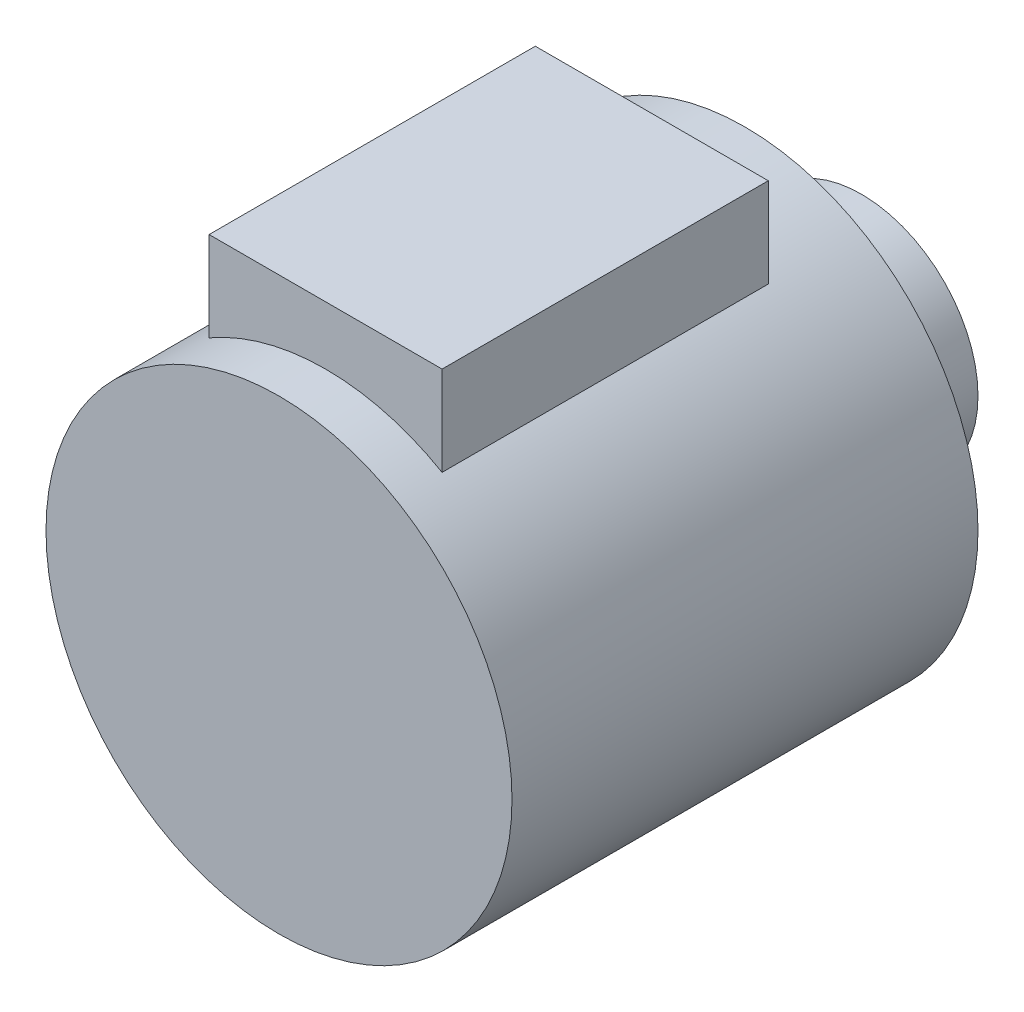
ISO-10303-21;
HEADER;
FILE_DESCRIPTION(('STEP AP214'),'2;1');
FILE_NAME('part.step','',(''),(''),'','','');
FILE_SCHEMA(('AUTOMOTIVE_DESIGN { 1 0 10303 214 1 1 1 1 }'));
ENDSEC;
DATA;
#1=APPLICATION_CONTEXT('core data for automotive mechanical design processes');
#2=APPLICATION_PROTOCOL_DEFINITION('international standard','automotive_design',2000,#1);
#3=PRODUCT_CONTEXT('',#1,'mechanical');
#4=PRODUCT('Part','Part','',(#3));
#5=PRODUCT_RELATED_PRODUCT_CATEGORY('part','',(#4));
#6=PRODUCT_DEFINITION_FORMATION('','',#4);
#7=PRODUCT_DEFINITION_CONTEXT('part definition',#1,'design');
#8=PRODUCT_DEFINITION('design','',#6,#7);
#9=PRODUCT_DEFINITION_SHAPE('','',#8);
#10=(LENGTH_UNIT() NAMED_UNIT(*) SI_UNIT(.MILLI.,.METRE.));
#11=(NAMED_UNIT(*) PLANE_ANGLE_UNIT() SI_UNIT($,.RADIAN.));
#12=(NAMED_UNIT(*) SI_UNIT($,.STERADIAN.) SOLID_ANGLE_UNIT());
#13=UNCERTAINTY_MEASURE_WITH_UNIT(LENGTH_MEASURE(1.E-05),#10,'distance_accuracy_value','');
#14=(GEOMETRIC_REPRESENTATION_CONTEXT(3) GLOBAL_UNCERTAINTY_ASSIGNED_CONTEXT((#13)) GLOBAL_UNIT_ASSIGNED_CONTEXT((#10,
#11,#12)) REPRESENTATION_CONTEXT('',''));
#15=CARTESIAN_POINT('',(0.,0.,0.));
#16=DIRECTION('',(0.,0.,1.));
#17=DIRECTION('',(1.,0.,0.));
#18=AXIS2_PLACEMENT_3D('',#15,#16,#17);
#19=CARTESIAN_POINT('',(0.,0.,50.));
#20=DIRECTION('',(0.,0.,-1.));
#21=DIRECTION('',(-1.,0.,0.));
#22=AXIS2_PLACEMENT_3D('',#19,#20,#21);
#23=CYLINDRICAL_SURFACE('',#22,20.);
#24=CARTESIAN_POINT('',(0.,0.,10.));
#25=DIRECTION('',(0.,0.,1.));
#26=DIRECTION('',(1.,0.,0.));
#27=AXIS2_PLACEMENT_3D('',#24,#25,#26);
#28=CIRCLE('',#27,20.);
#29=CARTESIAN_POINT('',(20.,0.,10.));
#30=VERTEX_POINT('',#29);
#31=EDGE_CURVE('E93',#30,#30,#28,.T.);
#32=ORIENTED_EDGE('',*,*,#31,.T.);
#33=EDGE_LOOP('',(#32));
#34=FACE_BOUND('',#33,.T.);
#35=CARTESIAN_POINT('',(0.,0.,50.));
#36=DIRECTION('',(0.,0.,1.));
#37=DIRECTION('',(1.,0.,0.));
#38=AXIS2_PLACEMENT_3D('',#35,#36,#37);
#39=CIRCLE('',#38,20.);
#40=CARTESIAN_POINT('',(20.,0.,50.));
#41=VERTEX_POINT('',#40);
#42=EDGE_CURVE('E96',#41,#41,#39,.T.);
#43=ORIENTED_EDGE('',*,*,#42,.F.);
#44=EDGE_LOOP('',(#43));
#45=FACE_BOUND('',#44,.T.);
#46=CARTESIAN_POINT('',(0.,0.,46.));
#47=DIRECTION('',(0.,0.,-1.));
#48=DIRECTION('',(-1.,0.,0.));
#49=AXIS2_PLACEMENT_3D('',#46,#47,#48);
#50=CIRCLE('',#49,20.);
#51=CARTESIAN_POINT('',(-9.99999999999999,17.3205080756888,46.));
#52=VERTEX_POINT('',#51);
#53=CARTESIAN_POINT('',(10.,17.3205080756888,46.));
#54=VERTEX_POINT('',#53);
#55=EDGE_CURVE('E11',#52,#54,#50,.T.);
#56=ORIENTED_EDGE('',*,*,#55,.F.);
#57=DIRECTION('',(0.,0.,-1.));
#58=VECTOR('',#57,1.);
#59=CARTESIAN_POINT('',(-9.99999999999999,17.3205080756888,50.));
#60=LINE('',#59,#58);
#61=CARTESIAN_POINT('',(-9.99999999999999,17.3205080756888,18.));
#62=VERTEX_POINT('',#61);
#63=EDGE_CURVE('E108',#62,#52,#60,.F.);
#64=ORIENTED_EDGE('',*,*,#63,.F.);
#65=CARTESIAN_POINT('',(0.,0.,18.));
#66=DIRECTION('',(0.,0.,1.));
#67=DIRECTION('',(1.,0.,0.));
#68=AXIS2_PLACEMENT_3D('',#65,#66,#67);
#69=CIRCLE('',#68,20.);
#70=CARTESIAN_POINT('',(9.99999999999999,17.3205080756888,18.));
#71=VERTEX_POINT('',#70);
#72=EDGE_CURVE('E53',#71,#62,#69,.T.);
#73=ORIENTED_EDGE('',*,*,#72,.F.);
#74=DIRECTION('',(0.,0.,-1.));
#75=VECTOR('',#74,1.);
#76=CARTESIAN_POINT('',(10.,17.3205080756888,50.));
#77=LINE('',#76,#75);
#78=EDGE_CURVE('E43',#54,#71,#77,.T.);
#79=ORIENTED_EDGE('',*,*,#78,.F.);
#80=EDGE_LOOP('',(#56,#64,#73,#79));
#81=FACE_BOUND('',#80,.T.);
#82=ADVANCED_FACE('F35',(#34,#45,#81),#23,.T.);
#83=CARTESIAN_POINT('',(0.,0.,10.));
#84=DIRECTION('',(0.,0.,-1.));
#85=DIRECTION('',(-1.,0.,0.));
#86=AXIS2_PLACEMENT_3D('',#83,#84,#85);
#87=CYLINDRICAL_SURFACE('',#86,10.);
#88=CARTESIAN_POINT('',(0.,0.,10.));
#89=DIRECTION('',(0.,0.,1.));
#90=DIRECTION('',(1.,0.,0.));
#91=AXIS2_PLACEMENT_3D('',#88,#89,#90);
#92=CIRCLE('',#91,10.);
#93=CARTESIAN_POINT('',(10.,0.,10.));
#94=VERTEX_POINT('',#93);
#95=EDGE_CURVE('E105',#94,#94,#92,.T.);
#96=ORIENTED_EDGE('',*,*,#95,.F.);
#97=EDGE_LOOP('',(#96));
#98=FACE_BOUND('',#97,.T.);
#99=CARTESIAN_POINT('',(0.,0.,0.));
#100=DIRECTION('',(0.,0.,1.));
#101=DIRECTION('',(1.,0.,0.));
#102=AXIS2_PLACEMENT_3D('',#99,#100,#101);
#103=CIRCLE('',#102,10.);
#104=CARTESIAN_POINT('',(10.,0.,0.));
#105=VERTEX_POINT('',#104);
#106=EDGE_CURVE('E103',#105,#105,#103,.T.);
#107=ORIENTED_EDGE('',*,*,#106,.T.);
#108=EDGE_LOOP('',(#107));
#109=FACE_BOUND('',#108,.T.);
#110=ADVANCED_FACE('F37',(#98,#109),#87,.T.);
#111=CARTESIAN_POINT('',(0.,0.,0.));
#112=DIRECTION('',(0.,0.,1.));
#113=DIRECTION('',(1.,0.,0.));
#114=AXIS2_PLACEMENT_3D('',#111,#112,#113);
#115=PLANE('',#114);
#116=ORIENTED_EDGE('',*,*,#106,.F.);
#117=EDGE_LOOP('',(#116));
#118=FACE_BOUND('',#117,.T.);
#119=ADVANCED_FACE('F129',(#118),#115,.F.);
#120=CARTESIAN_POINT('',(0.,0.,50.));
#121=DIRECTION('',(0.,0.,1.));
#122=DIRECTION('',(1.,0.,0.));
#123=AXIS2_PLACEMENT_3D('',#120,#121,#122);
#124=PLANE('',#123);
#125=ORIENTED_EDGE('',*,*,#42,.T.);
#126=EDGE_LOOP('',(#125));
#127=FACE_BOUND('',#126,.T.);
#128=ADVANCED_FACE('F136',(#127),#124,.T.);
#129=CARTESIAN_POINT('',(0.,0.,10.));
#130=DIRECTION('',(0.,0.,1.));
#131=DIRECTION('',(1.,0.,0.));
#132=AXIS2_PLACEMENT_3D('',#129,#130,#131);
#133=PLANE('',#132);
#134=ORIENTED_EDGE('',*,*,#95,.T.);
#135=EDGE_LOOP('',(#134));
#136=FACE_BOUND('',#135,.T.);
#137=ORIENTED_EDGE('',*,*,#31,.F.);
#138=EDGE_LOOP('',(#137));
#139=FACE_BOUND('',#138,.T.);
#140=ADVANCED_FACE('F133',(#136,#139),#133,.F.);
#141=CARTESIAN_POINT('',(10.,25.,18.));
#142=DIRECTION('',(-1.,0.,0.));
#143=DIRECTION('',(0.,0.,1.));
#144=AXIS2_PLACEMENT_3D('',#141,#142,#143);
#145=PLANE('',#144);
#146=DIRECTION('',(0.,-1.,0.));
#147=VECTOR('',#146,1.);
#148=CARTESIAN_POINT('',(10.,25.,46.));
#149=LINE('',#148,#147);
#150=CARTESIAN_POINT('',(10.,25.,46.));
#151=VERTEX_POINT('',#150);
#152=EDGE_CURVE('E76',#151,#54,#149,.T.);
#153=ORIENTED_EDGE('',*,*,#152,.T.);
#154=ORIENTED_EDGE('',*,*,#78,.T.);
#155=DIRECTION('',(0.,-1.,0.));
#156=VECTOR('',#155,1.);
#157=CARTESIAN_POINT('',(10.,25.,18.));
#158=LINE('',#157,#156);
#159=CARTESIAN_POINT('',(10.,25.,18.));
#160=VERTEX_POINT('',#159);
#161=EDGE_CURVE('E78',#160,#71,#158,.T.);
#162=ORIENTED_EDGE('',*,*,#161,.F.);
#163=DIRECTION('',(0.,0.,-1.));
#164=VECTOR('',#163,1.);
#165=CARTESIAN_POINT('',(10.,25.,18.));
#166=LINE('',#165,#164);
#167=EDGE_CURVE('E72',#151,#160,#166,.T.);
#168=ORIENTED_EDGE('',*,*,#167,.F.);
#169=EDGE_LOOP('',(#153,#154,#162,#168));
#170=FACE_BOUND('',#169,.T.);
#171=ADVANCED_FACE('F74',(#170),#145,.F.);
#172=CARTESIAN_POINT('',(-10.,25.,18.));
#173=DIRECTION('',(1.,0.,0.));
#174=DIRECTION('',(0.,0.,-1.));
#175=AXIS2_PLACEMENT_3D('',#172,#173,#174);
#176=PLANE('',#175);
#177=DIRECTION('',(0.,-1.,0.));
#178=VECTOR('',#177,1.);
#179=CARTESIAN_POINT('',(-10.,25.,18.));
#180=LINE('',#179,#178);
#181=CARTESIAN_POINT('',(-10.,25.,18.));
#182=VERTEX_POINT('',#181);
#183=EDGE_CURVE('E98',#182,#62,#180,.T.);
#184=ORIENTED_EDGE('',*,*,#183,.T.);
#185=ORIENTED_EDGE('',*,*,#63,.T.);
#186=DIRECTION('',(0.,-1.,0.));
#187=VECTOR('',#186,1.);
#188=CARTESIAN_POINT('',(-9.99999999999999,25.,46.));
#189=LINE('',#188,#187);
#190=CARTESIAN_POINT('',(-9.99999999999999,25.,46.));
#191=VERTEX_POINT('',#190);
#192=EDGE_CURVE('E118',#191,#52,#189,.T.);
#193=ORIENTED_EDGE('',*,*,#192,.F.);
#194=DIRECTION('',(0.,0.,1.));
#195=VECTOR('',#194,1.);
#196=CARTESIAN_POINT('',(-10.,25.,18.));
#197=LINE('',#196,#195);
#198=EDGE_CURVE('E87',#182,#191,#197,.T.);
#199=ORIENTED_EDGE('',*,*,#198,.F.);
#200=EDGE_LOOP('',(#184,#185,#193,#199));
#201=FACE_BOUND('',#200,.T.);
#202=ADVANCED_FACE('F122',(#201),#176,.F.);
#203=CARTESIAN_POINT('',(-9.99999999999999,25.,46.));
#204=DIRECTION('',(0.,0.,-1.));
#205=DIRECTION('',(-1.,0.,0.));
#206=AXIS2_PLACEMENT_3D('',#203,#204,#205);
#207=PLANE('',#206);
#208=ORIENTED_EDGE('',*,*,#192,.T.);
#209=ORIENTED_EDGE('',*,*,#55,.T.);
#210=ORIENTED_EDGE('',*,*,#152,.F.);
#211=DIRECTION('',(1.,0.,0.));
#212=VECTOR('',#211,1.);
#213=CARTESIAN_POINT('',(-9.99999999999999,25.,46.));
#214=LINE('',#213,#212);
#215=EDGE_CURVE('E82',#191,#151,#214,.T.);
#216=ORIENTED_EDGE('',*,*,#215,.F.);
#217=EDGE_LOOP('',(#208,#209,#210,#216));
#218=FACE_BOUND('',#217,.T.);
#219=ADVANCED_FACE('F92',(#218),#207,.F.);
#220=CARTESIAN_POINT('',(-10.,25.,18.));
#221=DIRECTION('',(0.,0.,1.));
#222=DIRECTION('',(1.,0.,0.));
#223=AXIS2_PLACEMENT_3D('',#220,#221,#222);
#224=PLANE('',#223);
#225=ORIENTED_EDGE('',*,*,#161,.T.);
#226=ORIENTED_EDGE('',*,*,#72,.T.);
#227=ORIENTED_EDGE('',*,*,#183,.F.);
#228=DIRECTION('',(-1.,0.,0.));
#229=VECTOR('',#228,1.);
#230=CARTESIAN_POINT('',(-10.,25.,18.));
#231=LINE('',#230,#229);
#232=EDGE_CURVE('E81',#160,#182,#231,.T.);
#233=ORIENTED_EDGE('',*,*,#232,.F.);
#234=EDGE_LOOP('',(#225,#226,#227,#233));
#235=FACE_BOUND('',#234,.T.);
#236=ADVANCED_FACE('F114',(#235),#224,.F.);
#237=CARTESIAN_POINT('',(0.,25.,0.));
#238=DIRECTION('',(0.,-1.,0.));
#239=DIRECTION('',(0.,0.,-1.));
#240=AXIS2_PLACEMENT_3D('',#237,#238,#239);
#241=PLANE('',#240);
#242=ORIENTED_EDGE('',*,*,#215,.T.);
#243=ORIENTED_EDGE('',*,*,#167,.T.);
#244=ORIENTED_EDGE('',*,*,#232,.T.);
#245=ORIENTED_EDGE('',*,*,#198,.T.);
#246=EDGE_LOOP('',(#242,#243,#244,#245));
#247=FACE_BOUND('',#246,.T.);
#248=ADVANCED_FACE('F85',(#247),#241,.F.);
#249=CLOSED_SHELL('',(#82,#110,#119,#128,#140,#171,#202,#219,#236,#248));
#250=MANIFOLD_SOLID_BREP('B2',#249);
#251=ADVANCED_BREP_SHAPE_REPRESENTATION('',(#18,#250),#14);
#252=SHAPE_DEFINITION_REPRESENTATION(#9,#251);
ENDSEC;
END-ISO-10303-21;
